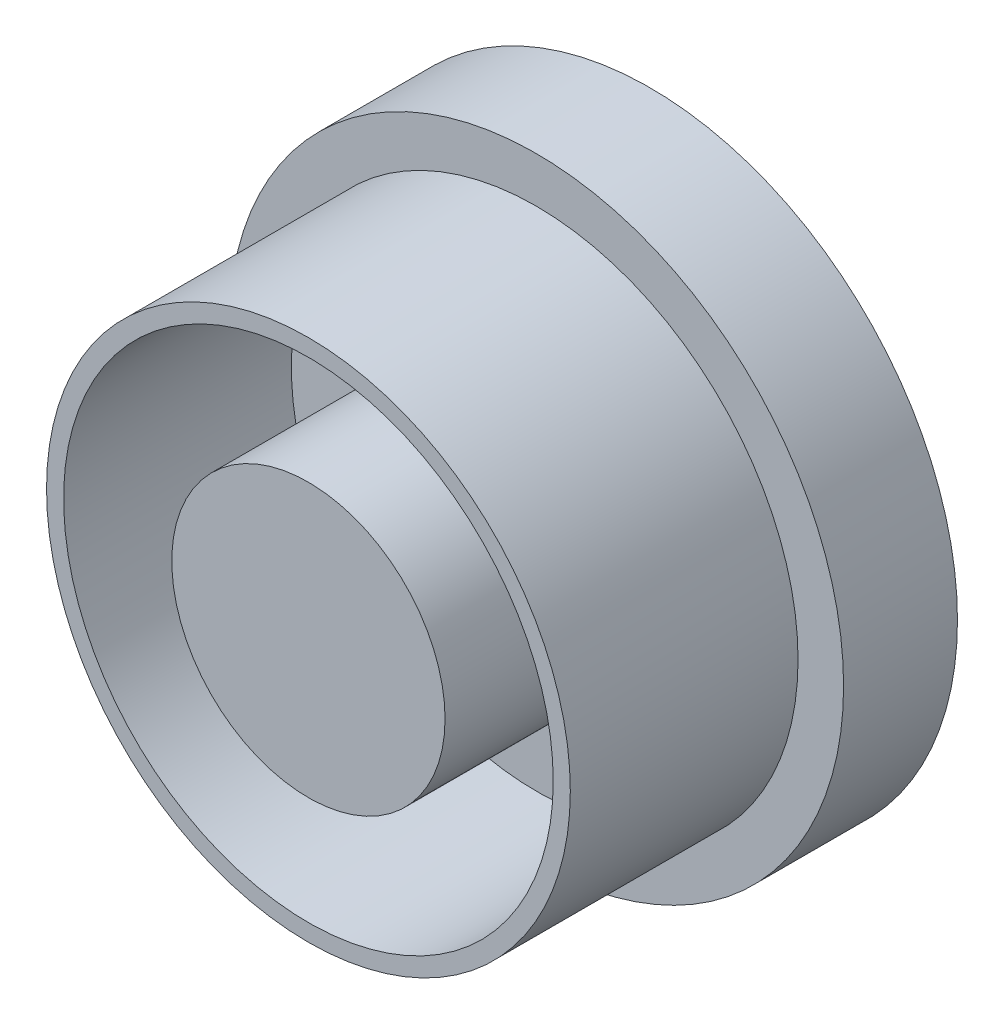
ISO-10303-21;
HEADER;
FILE_DESCRIPTION(('STEP AP214'),'2;1');
FILE_NAME('part.step','',(''),(''),'','','');
FILE_SCHEMA(('AUTOMOTIVE_DESIGN { 1 0 10303 214 1 1 1 1 }'));
ENDSEC;
DATA;
#1=APPLICATION_CONTEXT('core data for automotive mechanical design processes');
#2=APPLICATION_PROTOCOL_DEFINITION('international standard','automotive_design',2000,#1);
#3=PRODUCT_CONTEXT('',#1,'mechanical');
#4=PRODUCT('Part','Part','',(#3));
#5=PRODUCT_RELATED_PRODUCT_CATEGORY('part','',(#4));
#6=PRODUCT_DEFINITION_FORMATION('','',#4);
#7=PRODUCT_DEFINITION_CONTEXT('part definition',#1,'design');
#8=PRODUCT_DEFINITION('design','',#6,#7);
#9=PRODUCT_DEFINITION_SHAPE('','',#8);
#10=(LENGTH_UNIT() NAMED_UNIT(*) SI_UNIT(.MILLI.,.METRE.));
#11=(NAMED_UNIT(*) PLANE_ANGLE_UNIT() SI_UNIT($,.RADIAN.));
#12=(NAMED_UNIT(*) SI_UNIT($,.STERADIAN.) SOLID_ANGLE_UNIT());
#13=UNCERTAINTY_MEASURE_WITH_UNIT(LENGTH_MEASURE(1.E-05),#10,'distance_accuracy_value','');
#14=(GEOMETRIC_REPRESENTATION_CONTEXT(3) GLOBAL_UNCERTAINTY_ASSIGNED_CONTEXT((#13)) GLOBAL_UNIT_ASSIGNED_CONTEXT((#10,
#11,#12)) REPRESENTATION_CONTEXT('',''));
#15=CARTESIAN_POINT('',(0.,0.,0.));
#16=DIRECTION('',(0.,0.,1.));
#17=DIRECTION('',(1.,0.,0.));
#18=AXIS2_PLACEMENT_3D('',#15,#16,#17);
#19=CARTESIAN_POINT('',(0.,0.,5.));
#20=DIRECTION('',(0.,0.,1.));
#21=DIRECTION('',(1.,0.,0.));
#22=AXIS2_PLACEMENT_3D('',#19,#20,#21);
#23=PLANE('',#22);
#24=CARTESIAN_POINT('',(0.,0.,5.));
#25=DIRECTION('',(0.,0.,1.));
#26=DIRECTION('',(1.,0.,0.));
#27=AXIS2_PLACEMENT_3D('',#24,#25,#26);
#28=CIRCLE('',#27,10.75);
#29=CARTESIAN_POINT('',(10.75,0.,5.));
#30=VERTEX_POINT('',#29);
#31=EDGE_CURVE('E10',#30,#30,#28,.F.);
#32=ORIENTED_EDGE('',*,*,#31,.F.);
#33=EDGE_LOOP('',(#32));
#34=FACE_BOUND('',#33,.T.);
#35=CARTESIAN_POINT('',(0.,0.,5.));
#36=DIRECTION('',(0.,0.,1.));
#37=DIRECTION('',(1.,0.,0.));
#38=AXIS2_PLACEMENT_3D('',#35,#36,#37);
#39=CIRCLE('',#38,6.);
#40=CARTESIAN_POINT('',(6.,0.,5.));
#41=VERTEX_POINT('',#40);
#42=EDGE_CURVE('E58',#41,#41,#39,.T.);
#43=ORIENTED_EDGE('',*,*,#42,.F.);
#44=EDGE_LOOP('',(#43));
#45=FACE_BOUND('',#44,.T.);
#46=ADVANCED_FACE('F31',(#34,#45),#23,.T.);
#47=CARTESIAN_POINT('',(0.,0.,5.));
#48=DIRECTION('',(0.,0.,1.));
#49=DIRECTION('',(1.,0.,0.));
#50=AXIS2_PLACEMENT_3D('',#47,#48,#49);
#51=CIRCLE('',#50,13.5);
#52=CARTESIAN_POINT('',(13.5,0.,5.));
#53=VERTEX_POINT('',#52);
#54=EDGE_CURVE('E38',#53,#53,#51,.T.);
#55=ORIENTED_EDGE('',*,*,#54,.T.);
#56=EDGE_LOOP('',(#55));
#57=FACE_BOUND('',#56,.T.);
#58=CARTESIAN_POINT('',(0.,0.,5.));
#59=DIRECTION('',(0.,0.,1.));
#60=DIRECTION('',(1.,0.,0.));
#61=AXIS2_PLACEMENT_3D('',#58,#59,#60);
#62=CIRCLE('',#61,11.5);
#63=CARTESIAN_POINT('',(11.5,0.,5.));
#64=VERTEX_POINT('',#63);
#65=EDGE_CURVE('E49',#64,#64,#62,.T.);
#66=ORIENTED_EDGE('',*,*,#65,.F.);
#67=EDGE_LOOP('',(#66));
#68=FACE_BOUND('',#67,.T.);
#69=ADVANCED_FACE('F74',(#57,#68),#23,.T.);
#70=CARTESIAN_POINT('',(0.,0.,5.));
#71=DIRECTION('',(0.,0.,-1.));
#72=DIRECTION('',(-1.,0.,0.));
#73=AXIS2_PLACEMENT_3D('',#70,#71,#72);
#74=CYLINDRICAL_SURFACE('',#73,13.5);
#75=ORIENTED_EDGE('',*,*,#54,.F.);
#76=EDGE_LOOP('',(#75));
#77=FACE_BOUND('',#76,.T.);
#78=CARTESIAN_POINT('',(0.,0.,0.));
#79=DIRECTION('',(0.,0.,1.));
#80=DIRECTION('',(1.,0.,0.));
#81=AXIS2_PLACEMENT_3D('',#78,#79,#80);
#82=CIRCLE('',#81,13.5);
#83=CARTESIAN_POINT('',(13.5,0.,0.));
#84=VERTEX_POINT('',#83);
#85=EDGE_CURVE('E42',#84,#84,#82,.T.);
#86=ORIENTED_EDGE('',*,*,#85,.T.);
#87=EDGE_LOOP('',(#86));
#88=FACE_BOUND('',#87,.T.);
#89=ADVANCED_FACE('F33',(#77,#88),#74,.T.);
#90=CARTESIAN_POINT('',(0.,0.,0.));
#91=DIRECTION('',(0.,0.,1.));
#92=DIRECTION('',(1.,0.,0.));
#93=AXIS2_PLACEMENT_3D('',#90,#91,#92);
#94=PLANE('',#93);
#95=ORIENTED_EDGE('',*,*,#85,.F.);
#96=EDGE_LOOP('',(#95));
#97=FACE_BOUND('',#96,.T.);
#98=ADVANCED_FACE('F83',(#97),#94,.F.);
#99=CARTESIAN_POINT('',(0.,0.,15.));
#100=DIRECTION('',(0.,0.,1.));
#101=DIRECTION('',(1.,0.,0.));
#102=AXIS2_PLACEMENT_3D('',#99,#100,#101);
#103=PLANE('',#102);
#104=CARTESIAN_POINT('',(0.,0.,15.));
#105=DIRECTION('',(0.,0.,1.));
#106=DIRECTION('',(1.,0.,0.));
#107=AXIS2_PLACEMENT_3D('',#104,#105,#106);
#108=CIRCLE('',#107,11.5);
#109=CARTESIAN_POINT('',(11.5,0.,15.));
#110=VERTEX_POINT('',#109);
#111=EDGE_CURVE('E47',#110,#110,#108,.T.);
#112=ORIENTED_EDGE('',*,*,#111,.T.);
#113=EDGE_LOOP('',(#112));
#114=FACE_BOUND('',#113,.T.);
#115=CARTESIAN_POINT('',(0.,0.,15.));
#116=DIRECTION('',(0.,0.,1.));
#117=DIRECTION('',(1.,0.,0.));
#118=AXIS2_PLACEMENT_3D('',#115,#116,#117);
#119=CIRCLE('',#118,10.75);
#120=CARTESIAN_POINT('',(10.75,0.,15.));
#121=VERTEX_POINT('',#120);
#122=EDGE_CURVE('E52',#121,#121,#119,.T.);
#123=ORIENTED_EDGE('',*,*,#122,.F.);
#124=EDGE_LOOP('',(#123));
#125=FACE_BOUND('',#124,.T.);
#126=ADVANCED_FACE('F85',(#114,#125),#103,.T.);
#127=CARTESIAN_POINT('',(0.,0.,15.));
#128=DIRECTION('',(0.,0.,-1.));
#129=DIRECTION('',(-1.,0.,0.));
#130=AXIS2_PLACEMENT_3D('',#127,#128,#129);
#131=CYLINDRICAL_SURFACE('',#130,11.5);
#132=ORIENTED_EDGE('',*,*,#111,.F.);
#133=EDGE_LOOP('',(#132));
#134=FACE_BOUND('',#133,.T.);
#135=ORIENTED_EDGE('',*,*,#65,.T.);
#136=EDGE_LOOP('',(#135));
#137=FACE_BOUND('',#136,.T.);
#138=ADVANCED_FACE('F81',(#134,#137),#131,.T.);
#139=CARTESIAN_POINT('',(0.,0.,15.));
#140=DIRECTION('',(0.,0.,-1.));
#141=DIRECTION('',(-1.,0.,0.));
#142=AXIS2_PLACEMENT_3D('',#139,#140,#141);
#143=CYLINDRICAL_SURFACE('',#142,10.75);
#144=ORIENTED_EDGE('',*,*,#122,.T.);
#145=EDGE_LOOP('',(#144));
#146=FACE_BOUND('',#145,.T.);
#147=ORIENTED_EDGE('',*,*,#31,.T.);
#148=EDGE_LOOP('',(#147));
#149=FACE_BOUND('',#148,.T.);
#150=ADVANCED_FACE('F69',(#146,#149),#143,.F.);
#151=CARTESIAN_POINT('',(0.,0.,15.));
#152=DIRECTION('',(0.,0.,-1.));
#153=DIRECTION('',(-1.,0.,0.));
#154=AXIS2_PLACEMENT_3D('',#151,#152,#153);
#155=CYLINDRICAL_SURFACE('',#154,6.);
#156=CARTESIAN_POINT('',(0.,0.,15.));
#157=DIRECTION('',(0.,0.,1.));
#158=DIRECTION('',(1.,0.,0.));
#159=AXIS2_PLACEMENT_3D('',#156,#157,#158);
#160=CIRCLE('',#159,6.);
#161=CARTESIAN_POINT('',(6.,0.,15.));
#162=VERTEX_POINT('',#161);
#163=EDGE_CURVE('E57',#162,#162,#160,.T.);
#164=ORIENTED_EDGE('',*,*,#163,.F.);
#165=EDGE_LOOP('',(#164));
#166=FACE_BOUND('',#165,.T.);
#167=ORIENTED_EDGE('',*,*,#42,.T.);
#168=EDGE_LOOP('',(#167));
#169=FACE_BOUND('',#168,.T.);
#170=ADVANCED_FACE('F66',(#166,#169),#155,.T.);
#171=CARTESIAN_POINT('',(0.,0.,15.));
#172=DIRECTION('',(0.,0.,1.));
#173=DIRECTION('',(1.,0.,0.));
#174=AXIS2_PLACEMENT_3D('',#171,#172,#173);
#175=PLANE('',#174);
#176=ORIENTED_EDGE('',*,*,#163,.T.);
#177=EDGE_LOOP('',(#176));
#178=FACE_BOUND('',#177,.T.);
#179=ADVANCED_FACE('F64',(#178),#175,.T.);
#180=CLOSED_SHELL('',(#46,#69,#89,#98,#126,#138,#150,#170,#179));
#181=MANIFOLD_SOLID_BREP('B2',#180);
#182=ADVANCED_BREP_SHAPE_REPRESENTATION('',(#18,#181),#14);
#183=SHAPE_DEFINITION_REPRESENTATION(#9,#182);
ENDSEC;
END-ISO-10303-21;
